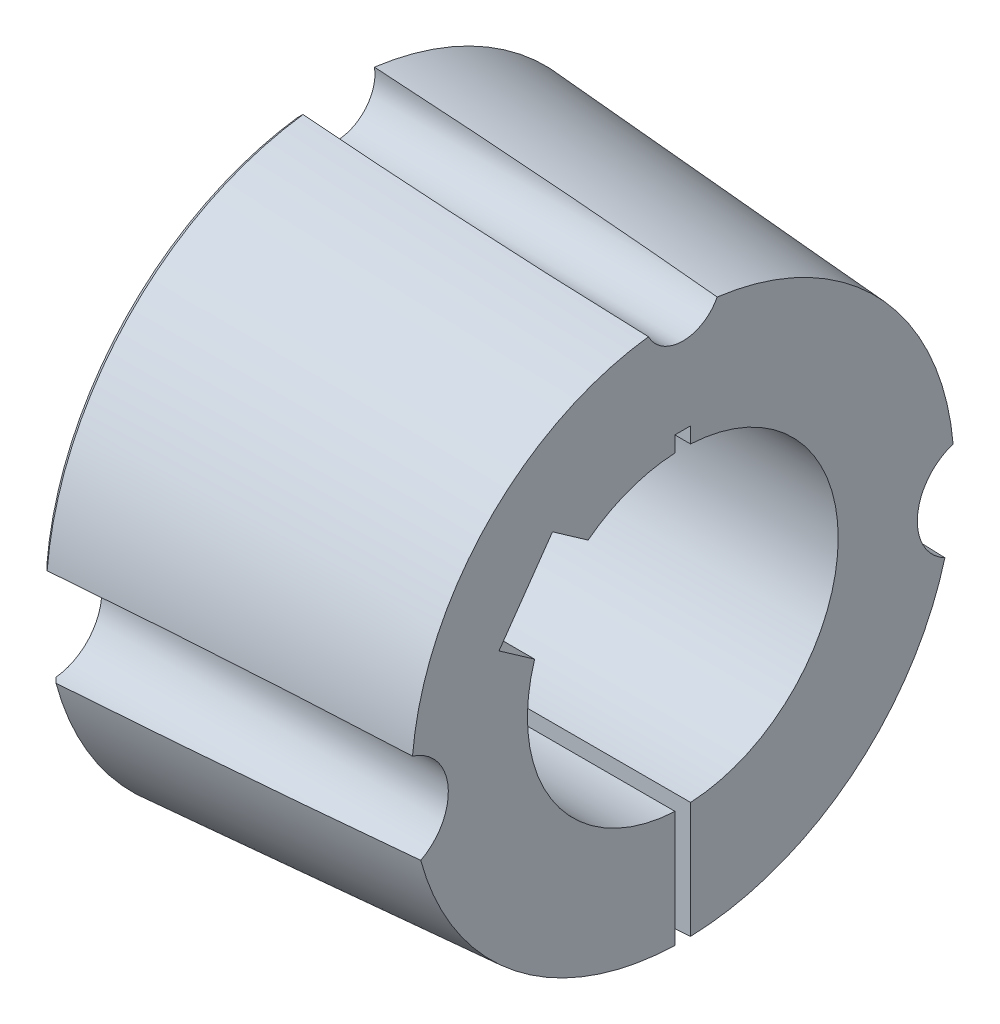
ISO-10303-21;
HEADER;
FILE_DESCRIPTION(('STEP AP214'),'2;1');
FILE_NAME('part.step','',(''),(''),'','','');
FILE_SCHEMA(('AUTOMOTIVE_DESIGN { 1 0 10303 214 1 1 1 1 }'));
ENDSEC;
DATA;
#1=APPLICATION_CONTEXT('core data for automotive mechanical design processes');
#2=APPLICATION_PROTOCOL_DEFINITION('international standard','automotive_design',2000,#1);
#3=PRODUCT_CONTEXT('',#1,'mechanical');
#4=PRODUCT('Part','Part','',(#3));
#5=PRODUCT_RELATED_PRODUCT_CATEGORY('part','',(#4));
#6=PRODUCT_DEFINITION_FORMATION('','',#4);
#7=PRODUCT_DEFINITION_CONTEXT('part definition',#1,'design');
#8=PRODUCT_DEFINITION('design','',#6,#7);
#9=PRODUCT_DEFINITION_SHAPE('','',#8);
#10=(LENGTH_UNIT() NAMED_UNIT(*) SI_UNIT(.MILLI.,.METRE.));
#11=(NAMED_UNIT(*) PLANE_ANGLE_UNIT() SI_UNIT($,.RADIAN.));
#12=(NAMED_UNIT(*) SI_UNIT($,.STERADIAN.) SOLID_ANGLE_UNIT());
#13=UNCERTAINTY_MEASURE_WITH_UNIT(LENGTH_MEASURE(1.E-05),#10,'distance_accuracy_value','');
#14=(GEOMETRIC_REPRESENTATION_CONTEXT(3) GLOBAL_UNCERTAINTY_ASSIGNED_CONTEXT((#13)) GLOBAL_UNIT_ASSIGNED_CONTEXT((#10,
#11,#12)) REPRESENTATION_CONTEXT('',''));
#15=CARTESIAN_POINT('',(0.,0.,0.));
#16=DIRECTION('',(0.,0.,1.));
#17=DIRECTION('',(1.,0.,0.));
#18=AXIS2_PLACEMENT_3D('',#15,#16,#17);
#19=CARTESIAN_POINT('',(0.321710613007411,0.,0.));
#20=DIRECTION('',(-1.,0.,0.));
#21=DIRECTION('',(0.,0.,1.));
#22=AXIS2_PLACEMENT_3D('',#19,#20,#21);
#23=CONICAL_SURFACE('',#22,19.,0.0698131700797628);
#24=CARTESIAN_POINT('',(22.300225,-4.53499188755196,16.8639897053293));
#25=CARTESIAN_POINT('',(21.2029926821861,-4.57130751276671,16.9336722948583));
#26=CARTESIAN_POINT('',(20.1057165569174,-4.60487346054122,17.0040785698467));
#27=CARTESIAN_POINT('',(17.9111518356493,-4.66665786067735,17.1463202732443));
#28=CARTESIAN_POINT('',(16.8138632420395,-4.69487653398318,17.2181556424691));
#29=CARTESIAN_POINT('',(14.4068561282718,-4.75108086887648,17.3772851707053));
#30=CARTESIAN_POINT('',(13.09713165849,-4.77796412131385,17.4648800967851));
#31=CARTESIAN_POINT('',(10.477686174,-4.82438424576258,17.6420807756362));
#32=CARTESIAN_POINT('',(9.16796515930409,-4.84392110290557,17.7316865324768));
#33=CARTESIAN_POINT('',(6.54844282741107,-4.87556126813518,17.9129223402927));
#34=CARTESIAN_POINT('',(5.23864151504193,-4.88766384255145,18.0045525901359));
#35=CARTESIAN_POINT('',(2.61913634890474,-4.90413958469964,18.1898507575066));
#36=CARTESIAN_POINT('',(1.30943249501736,-4.90851276205689,18.2835186724964));
#37=CARTESIAN_POINT('',(-0.00019999999999539,-4.90887484181706,18.3782164925177));
#38=B_SPLINE_CURVE_WITH_KNOTS('',3,(#24,#25,#26,#27,#28,#29,#30,#31,#32,#33,#34,#35,#36,#37),
.UNSPECIFIED.,.F.,.F.,(4,2,2,2,2,2,4),(0.,3.30012145594267,6.6001065243103,10.5388607907242,
14.4776230287312,18.4167739106898,22.3559198872624),.UNSPECIFIED.);
#39=CARTESIAN_POINT('',(22.3,-4.534999338213,16.8640039942232));
#40=VERTEX_POINT('',#39);
#41=CARTESIAN_POINT('',(0.321710613007422,-4.90871157534139,18.3549598384227));
#42=VERTEX_POINT('',#41);
#43=EDGE_CURVE('E224',#40,#42,#38,.T.);
#44=ORIENTED_EDGE('',*,*,#43,.T.);
#45=CARTESIAN_POINT('',(0.321710613007398,0.,0.));
#46=DIRECTION('',(1.,0.,0.));
#47=DIRECTION('',(0.,0.,-1.));
#48=AXIS2_PLACEMENT_3D('',#45,#46,#47);
#49=CIRCLE('',#48,19.);
#50=CARTESIAN_POINT('',(0.321710613007411,-18.9934199132226,0.5));
#51=VERTEX_POINT('',#50);
#52=EDGE_CURVE('E72',#42,#51,#49,.T.);
#53=ORIENTED_EDGE('',*,*,#52,.T.);
#54=CARTESIAN_POINT('',(21.9782893869913,-17.4784742972877,0.5));
#55=CARTESIAN_POINT('',(18.3688601645173,-17.7309734272602,0.5));
#56=CARTESIAN_POINT('',(14.7594306311375,-17.9834681128139,0.5));
#57=CARTESIAN_POINT('',(11.1500008240497,-18.2359588856954,0.5));
#58=CARTESIAN_POINT('',(7.54057101698096,-18.4884496585755,0.5));
#59=CARTESIAN_POINT('',(3.93114093613387,-18.7409365176545,0.5));
#60=CARTESIAN_POINT('',(0.32171061300711,-18.9934199132226,0.5));
#61=B_SPLINE_CURVE_WITH_KNOTS('',3,(#54,#55,#56,#57,#58,#59,#60),.UNSPECIFIED.,.F.,.F.,(4,3,4),
(37.090737703433,47.9454885576051,58.8002394117771),.UNSPECIFIED.);
#62=CARTESIAN_POINT('',(21.978289386993,-17.4784742972877,0.5));
#63=VERTEX_POINT('',#62);
#64=EDGE_CURVE('E796',#63,#51,#61,.T.);
#65=ORIENTED_EDGE('',*,*,#64,.F.);
#66=CARTESIAN_POINT('',(26.2312829592092,-17.1809522478635,0.5));
#67=CARTESIAN_POINT('',(25.5224507218221,-17.2305396084501,0.5));
#68=CARTESIAN_POINT('',(24.8136184721105,-17.2801267928621,0.5));
#69=CARTESIAN_POINT('',(23.3959539480384,-17.3793008093367,0.5));
#70=CARTESIAN_POINT('',(22.6871216736779,-17.4288876413994,0.5));
#71=CARTESIAN_POINT('',(21.978289386993,-17.4784742972875,0.5));
#72=B_SPLINE_CURVE_WITH_KNOTS('',3,(#66,#67,#68,#69,#70,#71),.UNSPECIFIED.,.F.,.F.,(4,2,4),(0.,
2.13169379222291,4.26338758444582),.UNSPECIFIED.);
#73=CARTESIAN_POINT('',(22.3,-17.4559688850195,0.5));
#74=VERTEX_POINT('',#73);
#75=EDGE_CURVE('E257',#63,#74,#72,.F.);
#76=ORIENTED_EDGE('',*,*,#75,.T.);
#77=CARTESIAN_POINT('',(22.3,0.,0.));
#78=DIRECTION('',(-1.,0.,0.));
#79=DIRECTION('',(0.,0.,1.));
#80=AXIS2_PLACEMENT_3D('',#77,#78,#79);
#81=CIRCLE('',#80,17.463128291196);
#82=EDGE_CURVE('E241',#40,#74,#81,.F.);
#83=ORIENTED_EDGE('',*,*,#82,.F.);
#84=EDGE_LOOP('',(#44,#53,#65,#76,#83));
#85=FACE_BOUND('',#84,.T.);
#86=ADVANCED_FACE('F55',(#85),#23,.T.);
#87=CARTESIAN_POINT('',(22.3,1.53769894641273,-17.3952962511413));
#88=VERTEX_POINT('',#87);
#89=CARTESIAN_POINT('',(22.3,17.32239041251,-2.21260934449595));
#90=VERTEX_POINT('',#89);
#91=EDGE_CURVE('E240',#88,#90,#81,.F.);
#92=ORIENTED_EDGE('',*,*,#91,.F.);
#93=CARTESIAN_POINT('',(22.3002249999999,1.53769409018434,-17.3952808855341));
#94=CARTESIAN_POINT('',(21.202992682186,1.56135774476451,-17.4702109820915));
#95=CARTESIAN_POINT('',(20.1057165569173,1.58218782902199,-17.5453762932236));
#96=CARTESIAN_POINT('',(17.9111518356493,1.61833357270802,-17.6961857740231));
#97=CARTESIAN_POINT('',(16.8138632420395,1.6336494600014,-17.7718299237719));
#98=CARTESIAN_POINT('',(14.4068561282718,1.661367372166,-17.9383016972433));
#99=CARTESIAN_POINT('',(13.09713165849,1.67263150830589,-18.0292340873667));
#100=CARTESIAN_POINT('',(10.477686174,1.68757583179495,-18.2118034597559));
#101=CARTESIAN_POINT('',(9.16796515930406,1.69125600379503,-18.3034404434472));
#102=CARTESIAN_POINT('',(6.54844282741105,1.69094421606452,-18.4874171291409));
#103=CARTESIAN_POINT('',(5.23864151504191,1.68695149927663,-18.5797568995894));
#104=CARTESIAN_POINT('',(2.61913634890473,1.67100024879185,-18.7651009540348));
#105=CARTESIAN_POINT('',(1.30943249501735,1.65904172501471,-18.858105237204));
#106=CARTESIAN_POINT('',(-0.000200000000002203,1.64295420009402,-18.9514272590448));
#107=B_SPLINE_CURVE_WITH_KNOTS('',3,(#93,#94,#95,#96,#97,#98,#99,#100,#101,#102,#103,#104,#105,
#106),.UNSPECIFIED.,.F.,.F.,(4,2,2,2,2,2,4),(0.,3.30012145594267,6.6001065243103,
10.5388607907242,14.4776230287312,18.4167739106897,22.3559198872623),.UNSPECIFIED.);
#108=CARTESIAN_POINT('',(0.,1.64295666159162,-18.9514130078315));
#109=VERTEX_POINT('',#108);
#110=EDGE_CURVE('E225',#88,#109,#107,.T.);
#111=ORIENTED_EDGE('',*,*,#110,.T.);
#112=CARTESIAN_POINT('',(0.,0.,0.));
#113=DIRECTION('',(1.,0.,0.));
#114=DIRECTION('',(0.,0.,-1.));
#115=AXIS2_PLACEMENT_3D('',#112,#113,#114);
#116=CIRCLE('',#115,19.022496197536);
#117=CARTESIAN_POINT('',(0.,18.8634118607901,-2.4550060194374));
#118=VERTEX_POINT('',#117);
#119=EDGE_CURVE('E252',#109,#118,#116,.T.);
#120=ORIENTED_EDGE('',*,*,#119,.T.);
#121=CARTESIAN_POINT('',(-0.000200000000000099,18.863426272307,-2.45500365126256));
#122=CARTESIAN_POINT('',(0.826947885151376,18.8038239635185,-2.46478635258426));
#123=CARTESIAN_POINT('',(1.65413976051982,18.7444903423746,-2.47231982342693));
#124=CARTESIAN_POINT('',(3.30854347423624,18.6263654517062,-2.48307237004027));
#125=CARTESIAN_POINT('',(4.13575530881794,18.5675741517388,-2.48629168946545));
#126=CARTESIAN_POINT('',(6.40763126479677,18.4068549672928,-2.48946286339212));
#127=CARTESIAN_POINT('',(7.85234190046941,18.3054811222879,-2.48518275713696));
#128=CARTESIAN_POINT('',(10.7417996378788,18.1043895627516,-2.4644587270166));
#129=CARTESIAN_POINT('',(12.1865467397797,18.0046718579365,-2.44801473181389));
#130=CARTESIAN_POINT('',(14.3537486035918,17.8563336972392,-2.41411441583646));
#131=CARTESIAN_POINT('',(15.0762352343916,17.8070891656695,-2.40127350529982));
#132=CARTESIAN_POINT('',(16.5211738381595,17.7090172339596,-2.37243213064376));
#133=CARTESIAN_POINT('',(17.243625811149,17.6601898335587,-2.35643166849922));
#134=CARTESIAN_POINT('',(18.6884749148327,17.5629534586444,-2.32115959760855));
#135=CARTESIAN_POINT('',(19.410872045767,17.5145444821794,-2.3018880041281));
#136=CARTESIAN_POINT('',(20.8555951097283,17.418145929262,-2.25988613995403));
#137=CARTESIAN_POINT('',(21.5779210426029,17.3701563536879,-2.23715586201814));
#138=CARTESIAN_POINT('',(22.3002,17.3223771823866,-2.21260254219919));
#139=B_SPLINE_CURVE_WITH_KNOTS('',3,(#121,#122,#123,#124,#125,#126,#127,#128,#129,#130,#131,
#132,#133,#134,#135,#136,#137,#138),.UNSPECIFIED.,.F.,.F.,(4,2,2,2,2,2,2,2,4),(0.,
2.48804415378838,4.97594778197863,9.3206995215316,13.6654767419331,15.8383012938678,
18.0111244876726,20.1839375416388,22.356755145399),.UNSPECIFIED.);
#140=EDGE_CURVE('E473',#118,#90,#139,.T.);
#141=ORIENTED_EDGE('',*,*,#140,.T.);
#142=EDGE_LOOP('',(#92,#111,#120,#141));
#143=FACE_BOUND('',#142,.T.);
#144=ADVANCED_FACE('F596',(#143),#23,.T.);
#145=CARTESIAN_POINT('',(22.3002,17.3223771823865,2.21260254219891));
#146=CARTESIAN_POINT('',(21.4731315502401,17.3770882374946,2.24071361094145));
#147=CARTESIAN_POINT('',(20.6460030232875,17.4320750783381,2.26644025400874));
#148=CARTESIAN_POINT('',(18.9917023426933,17.5425953827706,2.31339333712401));
#149=CARTESIAN_POINT('',(18.1645301942971,17.5981288147379,2.33462003592232));
#150=CARTESIAN_POINT('',(15.8927454304661,17.7513951782891,2.38710955603155));
#151=CARTESIAN_POINT('',(14.4480690220482,17.8496896996566,2.41403888197611));
#152=CARTESIAN_POINT('',(11.5586472557555,18.0479420943283,2.45565782221605));
#153=CARTESIAN_POINT('',(10.1139018974634,18.147899979455,2.47034734947711));
#154=CARTESIAN_POINT('',(7.22415880783465,18.3494920202942,2.48753377254478));
#155=CARTESIAN_POINT('',(5.77916108448604,18.4511265106142,2.49002820424783));
#156=CARTESIAN_POINT('',(3.61178688625728,18.6048138972709,2.48423978385791));
#157=CARTESIAN_POINT('',(2.88935148918672,18.656248804361,2.48072199177891));
#158=CARTESIAN_POINT('',(1.44453288664433,18.7595295936493,2.47037753456222));
#159=CARTESIAN_POINT('',(0.722149681244098,18.8113754764009,2.4635508649685));
#160=CARTESIAN_POINT('',(-0.000199999999999866,18.863426272307,2.45500365126257));
#161=B_SPLINE_CURVE_WITH_KNOTS('',3,(#145,#146,#147,#148,#149,#150,#151,#152,#153,#154,#155,
#156,#157,#158,#159,#160),.UNSPECIFIED.,.F.,.F.,(4,2,2,2,2,2,2,4),(0.,2.48804980679473,
4.97595650994824,9.32069752319305,13.6654694306017,18.0111191930098,20.1839304112457,
22.3567445555784),.UNSPECIFIED.);
#162=CARTESIAN_POINT('',(22.3,17.32239041251,2.21260934449595));
#163=VERTEX_POINT('',#162);
#164=CARTESIAN_POINT('',(0.321710613007411,18.8402438871912,2.45870093162105));
#165=VERTEX_POINT('',#164);
#166=EDGE_CURVE('E482',#163,#165,#161,.T.);
#167=ORIENTED_EDGE('',*,*,#166,.T.);
#168=CARTESIAN_POINT('',(0.321710613007398,0.,0.));
#169=DIRECTION('',(1.,0.,0.));
#170=DIRECTION('',(0.,0.,-1.));
#171=AXIS2_PLACEMENT_3D('',#168,#169,#170);
#172=CIRCLE('',#171,19.);
#173=CARTESIAN_POINT('',(0.321710613007408,1.64683188960518,18.928495574857));
#174=VERTEX_POINT('',#173);
#175=EDGE_CURVE('E221',#165,#174,#172,.T.);
#176=ORIENTED_EDGE('',*,*,#175,.T.);
#177=CARTESIAN_POINT('',(-0.000200000000001238,1.64295420009402,18.9514272590448));
#178=CARTESIAN_POINT('',(1.09697884318652,1.65644274797768,18.8732452548758));
#179=CARTESIAN_POINT('',(2.19420780325158,1.66702030103823,18.7952851082029));
#180=CARTESIAN_POINT('',(4.38869275780707,1.68254672135523,18.6398308375964));
#181=CARTESIAN_POINT('',(5.48594874926451,1.6874958232003,18.5623366943741));
#182=CARTESIAN_POINT('',(7.89290156631143,1.69239176741303,18.392876639078));
#183=CARTESIAN_POINT('',(9.20260800945734,1.69118491240795,18.3010130150501));
#184=CARTESIAN_POINT('',(11.8220435960219,1.68117182285268,18.1179876587348));
#185=CARTESIAN_POINT('',(13.1317727394874,1.67236557007188,18.0268259281318));
#186=CARTESIAN_POINT('',(15.7513379372384,1.64715838942917,17.8451990431438));
#187=CARTESIAN_POINT('',(17.0611739891641,1.6307567044744,17.7547339591129));
#188=CARTESIAN_POINT('',(19.6807690472532,1.59013999727152,17.5744938834072));
#189=CARTESIAN_POINT('',(20.9905280535943,1.56592499381336,17.4847188900735));
#190=CARTESIAN_POINT('',(22.3002249999999,1.53769409018434,17.3952808855341));
#191=B_SPLINE_CURVE_WITH_KNOTS('',3,(#177,#178,#179,#180,#181,#182,#183,#184,#185,#186,#187,
#188,#189,#190),.UNSPECIFIED.,.F.,.F.,(4,2,2,2,2,2,4),(0.,3.30012436560101,6.60011118003683,
10.5388623238024,14.4776229164753,18.41677619906,22.3559200085984),.UNSPECIFIED.);
#192=CARTESIAN_POINT('',(22.3,1.53769894641273,17.3952962511413));
#193=VERTEX_POINT('',#192);
#194=EDGE_CURVE('E214',#174,#193,#191,.T.);
#195=ORIENTED_EDGE('',*,*,#194,.T.);
#196=EDGE_CURVE('E219',#163,#193,#81,.F.);
#197=ORIENTED_EDGE('',*,*,#196,.F.);
#198=EDGE_LOOP('',(#167,#176,#195,#197));
#199=FACE_BOUND('',#198,.T.);
#200=ADVANCED_FACE('F217',(#199),#23,.T.);
#201=CARTESIAN_POINT('',(0.,0.,0.));
#202=DIRECTION('',(1.,0.,0.));
#203=DIRECTION('',(0.,0.,-1.));
#204=AXIS2_PLACEMENT_3D('',#201,#202,#203);
#205=CYLINDRICAL_SURFACE('',#204,10.);
#206=CARTESIAN_POINT('',(0.,0.,0.));
#207=DIRECTION('',(1.,0.,0.));
#208=DIRECTION('',(0.,0.,-1.));
#209=AXIS2_PLACEMENT_3D('',#206,#207,#208);
#210=CIRCLE('',#209,10.);
#211=CARTESIAN_POINT('',(0.,9.98749217771904,0.5));
#212=VERTEX_POINT('',#211);
#213=CARTESIAN_POINT('',(-6.25000000191445E-06,7.92902660930991,6.09348316062781));
#214=VERTEX_POINT('',#213);
#215=EDGE_CURVE('E655',#212,#214,#210,.T.);
#216=ORIENTED_EDGE('',*,*,#215,.F.);
#217=DIRECTION('',(1.,0.,0.));
#218=VECTOR('',#217,1.);
#219=CARTESIAN_POINT('',(0.,9.98749217771904,0.5));
#220=LINE('',#219,#218);
#221=CARTESIAN_POINT('',(22.3,9.98749217771904,0.5));
#222=VERTEX_POINT('',#221);
#223=EDGE_CURVE('E642',#212,#222,#220,.T.);
#224=ORIENTED_EDGE('',*,*,#223,.T.);
#225=CARTESIAN_POINT('',(22.3,0.,0.));
#226=DIRECTION('',(1.,0.,0.));
#227=DIRECTION('',(0.,0.,-1.));
#228=AXIS2_PLACEMENT_3D('',#225,#226,#227);
#229=CIRCLE('',#228,10.);
#230=CARTESIAN_POINT('',(22.3,7.92902660930991,6.09348316062782));
#231=VERTEX_POINT('',#230);
#232=EDGE_CURVE('E790',#222,#231,#229,.T.);
#233=ORIENTED_EDGE('',*,*,#232,.T.);
#234=DIRECTION('',(1.,0.,0.));
#235=VECTOR('',#234,1.);
#236=CARTESIAN_POINT('',(0.,7.92902660930991,6.09348316062781));
#237=LINE('',#236,#235);
#238=EDGE_CURVE('E676',#231,#214,#237,.F.);
#239=ORIENTED_EDGE('',*,*,#238,.T.);
#240=EDGE_LOOP('',(#216,#224,#233,#239));
#241=FACE_BOUND('',#240,.T.);
#242=ADVANCED_FACE('F584',(#241),#205,.F.);
#243=CARTESIAN_POINT('',(-6.25000000191445E-06,3.01411434357601,9.53494177873411));
#244=VERTEX_POINT('',#243);
#245=CARTESIAN_POINT('',(0.,-9.98749217771914,0.5));
#246=VERTEX_POINT('',#245);
#247=EDGE_CURVE('E659',#244,#246,#210,.T.);
#248=ORIENTED_EDGE('',*,*,#247,.F.);
#249=DIRECTION('',(1.,0.,0.));
#250=VECTOR('',#249,1.);
#251=CARTESIAN_POINT('',(0.,3.01411434357601,9.53494177873411));
#252=LINE('',#251,#250);
#253=CARTESIAN_POINT('',(22.3,3.01411434357601,9.53494177873411));
#254=VERTEX_POINT('',#253);
#255=EDGE_CURVE('E652',#244,#254,#252,.T.);
#256=ORIENTED_EDGE('',*,*,#255,.T.);
#257=CARTESIAN_POINT('',(22.3,-9.98749217771914,0.5));
#258=VERTEX_POINT('',#257);
#259=EDGE_CURVE('E703',#254,#258,#229,.T.);
#260=ORIENTED_EDGE('',*,*,#259,.T.);
#261=DIRECTION('',(1.,0.,0.));
#262=VECTOR('',#261,1.);
#263=CARTESIAN_POINT('',(22.3,-9.98749217771914,0.5));
#264=LINE('',#263,#262);
#265=EDGE_CURVE('E266',#258,#246,#264,.F.);
#266=ORIENTED_EDGE('',*,*,#265,.T.);
#267=EDGE_LOOP('',(#248,#256,#260,#266));
#268=FACE_BOUND('',#267,.T.);
#269=ADVANCED_FACE('F585',(#268),#205,.F.);
#270=CARTESIAN_POINT('',(22.3,-19.,-0.5));
#271=DIRECTION('',(0.,0.,1.));
#272=DIRECTION('',(1.,0.,0.));
#273=AXIS2_PLACEMENT_3D('',#270,#271,#272);
#274=PLANE('',#273);
#275=DIRECTION('',(0.,1.,0.));
#276=VECTOR('',#275,1.);
#277=CARTESIAN_POINT('',(0.,-18.6933143128767,-0.5));
#278=LINE('',#277,#276);
#279=CARTESIAN_POINT('',(0.,-18.6933143128767,-0.5));
#280=VERTEX_POINT('',#279);
#281=CARTESIAN_POINT('',(0.,-9.98749217771914,-0.5));
#282=VERTEX_POINT('',#281);
#283=EDGE_CURVE('E773',#280,#282,#278,.T.);
#284=ORIENTED_EDGE('',*,*,#283,.F.);
#285=CARTESIAN_POINT('',(0.,-18.6933143128767,-0.5));
#286=CARTESIAN_POINT('',(0.053618295711693,-18.7433320627875,-0.5));
#287=CARTESIAN_POINT('',(0.107236661318159,-18.7933497377718,-0.5));
#288=CARTESIAN_POINT('',(0.214473532320634,-18.8933849378871,-0.5));
#289=CARTESIAN_POINT('',(0.268092037716643,-18.9434024630181,-0.5));
#290=CARTESIAN_POINT('',(0.321710613007425,-18.9934199132226,-0.5));
#291=B_SPLINE_CURVE_WITH_KNOTS('',3,(#285,#286,#287,#288,#289,#290),.UNSPECIFIED.,.F.,.F.,(4,2,
4),(0.,0.219977890866889,0.439955781733767),.UNSPECIFIED.);
#292=CARTESIAN_POINT('',(0.321710613007411,-18.9934199132226,-0.5));
#293=VERTEX_POINT('',#292);
#294=EDGE_CURVE('E609',#280,#293,#291,.T.);
#295=ORIENTED_EDGE('',*,*,#294,.T.);
#296=CARTESIAN_POINT('',(0.321710613007335,-18.9934199132226,-0.5));
#297=CARTESIAN_POINT('',(1.40858716992892,-18.9173917705274,-0.5));
#298=CARTESIAN_POINT('',(2.49546370484753,-18.8413633132852,-0.5));
#299=CARTESIAN_POINT('',(3.58234021695097,-18.7653345298854,-0.5));
#300=CARTESIAN_POINT('',(9.71432405345054,-18.3363922666888,-0.5));
#301=CARTESIAN_POINT('',(15.8463071675463,-17.9074396765716,-0.5));
#302=CARTESIAN_POINT('',(21.9782893869957,-17.4784742972874,-0.5));
#303=B_SPLINE_CURVE_WITH_KNOTS('',3,(#296,#297,#298,#299,#300,#301,#302),.UNSPECIFIED.,.F.,.F.,
(4,3,4),(37.0907060555158,40.3593033626361,58.8002077636762),.UNSPECIFIED.);
#304=CARTESIAN_POINT('',(21.978289386993,-17.4784742972877,-0.5));
#305=VERTEX_POINT('',#304);
#306=EDGE_CURVE('E635',#293,#305,#303,.T.);
#307=ORIENTED_EDGE('',*,*,#306,.T.);
#308=CARTESIAN_POINT('',(26.2312829592092,-17.1809522478635,-0.5));
#309=CARTESIAN_POINT('',(25.5224507218221,-17.2305396084501,-0.5));
#310=CARTESIAN_POINT('',(24.8136184721105,-17.2801267928621,-0.5));
#311=CARTESIAN_POINT('',(23.3959539480384,-17.3793008093367,-0.5));
#312=CARTESIAN_POINT('',(22.6871216736779,-17.4288876413994,-0.5));
#313=CARTESIAN_POINT('',(21.978289386993,-17.4784742972875,-0.5));
#314=B_SPLINE_CURVE_WITH_KNOTS('',3,(#308,#309,#310,#311,#312,#313),.UNSPECIFIED.,.F.,.F.,(4,2,
4),(0.,2.13169379222291,4.26338758444582),.UNSPECIFIED.);
#315=CARTESIAN_POINT('',(22.3,-17.4559688850195,-0.5));
#316=VERTEX_POINT('',#315);
#317=EDGE_CURVE('E247',#305,#316,#314,.F.);
#318=ORIENTED_EDGE('',*,*,#317,.T.);
#319=DIRECTION('',(0.,1.,0.));
#320=VECTOR('',#319,1.);
#321=CARTESIAN_POINT('',(22.3,-17.1333379284425,-0.5));
#322=LINE('',#321,#320);
#323=CARTESIAN_POINT('',(22.3,-9.98749217771914,-0.5));
#324=VERTEX_POINT('',#323);
#325=EDGE_CURVE('E775',#316,#324,#322,.T.);
#326=ORIENTED_EDGE('',*,*,#325,.T.);
#327=DIRECTION('',(1.,0.,0.));
#328=VECTOR('',#327,1.);
#329=CARTESIAN_POINT('',(22.3,-9.98749217771914,-0.5));
#330=LINE('',#329,#328);
#331=EDGE_CURVE('E334',#282,#324,#330,.T.);
#332=ORIENTED_EDGE('',*,*,#331,.F.);
#333=EDGE_LOOP('',(#284,#295,#307,#318,#326,#332));
#334=FACE_BOUND('',#333,.T.);
#335=ADVANCED_FACE('F411',(#334),#274,.T.);
#336=CARTESIAN_POINT('',(0.,0.,0.));
#337=DIRECTION('',(1.,0.,0.));
#338=DIRECTION('',(0.,0.,-1.));
#339=AXIS2_PLACEMENT_3D('',#336,#337,#338);
#340=PLANE('',#339);
#341=CARTESIAN_POINT('',(0.,-1.60889501112176,18.3897541267737));
#342=DIRECTION('',(-1.,0.,0.));
#343=DIRECTION('',(0.,0.,1.));
#344=AXIS2_PLACEMENT_3D('',#341,#342,#343);
#345=CIRCLE('',#344,3.29999999999999);
#346=CARTESIAN_POINT('',(0.,1.68277130914276,18.6241316769702));
#347=VERTEX_POINT('',#346);
#348=CARTESIAN_POINT('',(0.,-4.8912527581251,18.0489790973377));
#349=VERTEX_POINT('',#348);
#350=EDGE_CURVE('E760',#347,#349,#345,.T.);
#351=ORIENTED_EDGE('',*,*,#350,.F.);
#352=CARTESIAN_POINT('',(0.,0.,0.));
#353=DIRECTION('',(1.,0.,0.));
#354=DIRECTION('',(0.,0.,-1.));
#355=AXIS2_PLACEMENT_3D('',#352,#353,#354);
#356=CIRCLE('',#355,18.7);
#357=CARTESIAN_POINT('',(0.,18.5339058590222,2.48683204276087));
#358=VERTEX_POINT('',#357);
#359=EDGE_CURVE('E544',#347,#358,#356,.F.);
#360=ORIENTED_EDGE('',*,*,#359,.T.);
#361=CARTESIAN_POINT('',(0.,18.46,0.));
#362=DIRECTION('',(-1.,0.,0.));
#363=DIRECTION('',(0.,0.,1.));
#364=AXIS2_PLACEMENT_3D('',#361,#362,#363);
#365=CIRCLE('',#364,2.48793);
#366=EDGE_CURVE('E751',#118,#358,#365,.T.);
#367=ORIENTED_EDGE('',*,*,#366,.F.);
#368=ORIENTED_EDGE('',*,*,#119,.F.);
#369=CARTESIAN_POINT('',(0.,-1.60889501112176,-18.3897541267737));
#370=DIRECTION('',(-1.,0.,0.));
#371=DIRECTION('',(0.,0.,1.));
#372=AXIS2_PLACEMENT_3D('',#369,#370,#371);
#373=CIRCLE('',#372,3.29999999999999);
#374=CARTESIAN_POINT('',(0.,-4.8912527581251,-18.0489790973377));
#375=VERTEX_POINT('',#374);
#376=EDGE_CURVE('E757',#375,#109,#373,.T.);
#377=ORIENTED_EDGE('',*,*,#376,.F.);
#378=CARTESIAN_POINT('',(0.,0.,0.));
#379=DIRECTION('',(1.,0.,0.));
#380=DIRECTION('',(0.,0.,-1.));
#381=AXIS2_PLACEMENT_3D('',#378,#379,#380);
#382=CIRCLE('',#381,18.7);
#383=EDGE_CURVE('E768',#375,#280,#382,.F.);
#384=ORIENTED_EDGE('',*,*,#383,.T.);
#385=ORIENTED_EDGE('',*,*,#283,.T.);
#386=CARTESIAN_POINT('',(0.,9.98749217771904,-0.5));
#387=VERTEX_POINT('',#386);
#388=EDGE_CURVE('E658',#282,#387,#210,.T.);
#389=ORIENTED_EDGE('',*,*,#388,.T.);
#390=DIRECTION('',(0.,1.,0.));
#391=VECTOR('',#390,1.);
#392=CARTESIAN_POINT('',(0.,0.,-0.5));
#393=LINE('',#392,#391);
#394=CARTESIAN_POINT('',(0.,11.,-0.5));
#395=VERTEX_POINT('',#394);
#396=EDGE_CURVE('E728',#387,#395,#393,.T.);
#397=ORIENTED_EDGE('',*,*,#396,.T.);
#398=DIRECTION('',(0.,0.,1.));
#399=VECTOR('',#398,1.);
#400=CARTESIAN_POINT('',(0.,11.,0.));
#401=LINE('',#400,#399);
#402=CARTESIAN_POINT('',(0.,11.,0.5));
#403=VERTEX_POINT('',#402);
#404=EDGE_CURVE('E720',#395,#403,#401,.T.);
#405=ORIENTED_EDGE('',*,*,#404,.T.);
#406=DIRECTION('',(0.,-1.,0.));
#407=VECTOR('',#406,1.);
#408=CARTESIAN_POINT('',(0.,0.,0.5));
#409=LINE('',#408,#407);
#410=EDGE_CURVE('E724',#403,#212,#409,.T.);
#411=ORIENTED_EDGE('',*,*,#410,.T.);
#412=ORIENTED_EDGE('',*,*,#215,.T.);
#413=DIRECTION('',(0.,0.573576436351084,0.819152044288965));
#414=VECTOR('',#413,1.);
#415=CARTESIAN_POINT('',(0.,2.45745613286654,-1.72072930905301));
#416=LINE('',#415,#414);
#417=CARTESIAN_POINT('',(0.,9.53504063109267,8.38710888463652));
#418=VERTEX_POINT('',#417);
#419=EDGE_CURVE('E695',#214,#418,#416,.T.);
#420=ORIENTED_EDGE('',*,*,#419,.T.);
#421=DIRECTION('',(0.,-0.819152044288965,0.573576436351084));
#422=VECTOR('',#421,1.);
#423=CARTESIAN_POINT('',(0.,7.07758449822612,10.1078381936895));
#424=LINE('',#423,#422);
#425=CARTESIAN_POINT('',(0.,4.6201283653589,11.828567502743));
#426=VERTEX_POINT('',#425);
#427=EDGE_CURVE('E694',#418,#426,#424,.T.);
#428=ORIENTED_EDGE('',*,*,#427,.T.);
#429=DIRECTION('',(0.,-0.573576436351085,-0.819152044288965));
#430=VECTOR('',#429,1.);
#431=CARTESIAN_POINT('',(0.,-2.45745613286723,1.72072930905349));
#432=LINE('',#431,#430);
#433=EDGE_CURVE('E690',#426,#244,#432,.T.);
#434=ORIENTED_EDGE('',*,*,#433,.T.);
#435=ORIENTED_EDGE('',*,*,#247,.T.);
#436=DIRECTION('',(0.,-1.,0.));
#437=VECTOR('',#436,1.);
#438=CARTESIAN_POINT('',(0.,-9.98749217771913,0.5));
#439=LINE('',#438,#437);
#440=CARTESIAN_POINT('',(0.,-18.6933143128767,0.5));
#441=VERTEX_POINT('',#440);
#442=EDGE_CURVE('E340',#246,#441,#439,.T.);
#443=ORIENTED_EDGE('',*,*,#442,.T.);
#444=CARTESIAN_POINT('',(0.,0.,0.));
#445=DIRECTION('',(1.,0.,0.));
#446=DIRECTION('',(0.,0.,-1.));
#447=AXIS2_PLACEMENT_3D('',#444,#445,#446);
#448=CIRCLE('',#447,18.7);
#449=EDGE_CURVE('E765',#441,#349,#448,.F.);
#450=ORIENTED_EDGE('',*,*,#449,.T.);
#451=EDGE_LOOP('',(#351,#360,#367,#368,#377,#384,#385,#389,#397,#405,#411,#412,#420,#428,#434,
#435,#443,#450));
#452=FACE_BOUND('',#451,.T.);
#453=ADVANCED_FACE('F586',(#452),#340,.F.);
#454=CARTESIAN_POINT('',(22.3,23.473965426993,0.));
#455=DIRECTION('',(-1.,0.,0.));
#456=DIRECTION('',(0.,0.,1.));
#457=AXIS2_PLACEMENT_3D('',#454,#455,#456);
#458=PLANE('',#457);
#459=ORIENTED_EDGE('',*,*,#196,.T.);
#460=CARTESIAN_POINT('',(22.3,-1.60889501112176,18.3897541267737));
#461=DIRECTION('',(-1.,0.,0.));
#462=DIRECTION('',(0.,0.,1.));
#463=AXIS2_PLACEMENT_3D('',#460,#461,#462);
#464=CIRCLE('',#463,3.29999999999999);
#465=EDGE_CURVE('E228',#193,#40,#464,.T.);
#466=ORIENTED_EDGE('',*,*,#465,.T.);
#467=ORIENTED_EDGE('',*,*,#82,.T.);
#468=DIRECTION('',(0.,-1.,0.));
#469=VECTOR('',#468,1.);
#470=CARTESIAN_POINT('',(22.3,-9.98749217771913,0.5));
#471=LINE('',#470,#469);
#472=EDGE_CURVE('E299',#258,#74,#471,.T.);
#473=ORIENTED_EDGE('',*,*,#472,.F.);
#474=ORIENTED_EDGE('',*,*,#259,.F.);
#475=DIRECTION('',(0.,-0.573576436351085,-0.819152044288965));
#476=VECTOR('',#475,1.);
#477=CARTESIAN_POINT('',(22.3,4.6201283653589,11.828567502743));
#478=LINE('',#477,#476);
#479=CARTESIAN_POINT('',(22.3,4.6201283653589,11.828567502743));
#480=VERTEX_POINT('',#479);
#481=EDGE_CURVE('E707',#480,#254,#478,.T.);
#482=ORIENTED_EDGE('',*,*,#481,.F.);
#483=DIRECTION('',(0.,-0.819152044288965,0.573576436351084));
#484=VECTOR('',#483,1.);
#485=CARTESIAN_POINT('',(22.3,9.53504063109267,8.38710888463652));
#486=LINE('',#485,#484);
#487=CARTESIAN_POINT('',(22.3,9.53504063109267,8.38710888463652));
#488=VERTEX_POINT('',#487);
#489=EDGE_CURVE('E712',#488,#480,#486,.T.);
#490=ORIENTED_EDGE('',*,*,#489,.F.);
#491=DIRECTION('',(0.,0.573576436351084,0.819152044288965));
#492=VECTOR('',#491,1.);
#493=CARTESIAN_POINT('',(22.3,7.92902660930991,6.09348316062782));
#494=LINE('',#493,#492);
#495=EDGE_CURVE('E716',#231,#488,#494,.T.);
#496=ORIENTED_EDGE('',*,*,#495,.F.);
#497=ORIENTED_EDGE('',*,*,#232,.F.);
#498=DIRECTION('',(0.,-1.,0.));
#499=VECTOR('',#498,1.);
#500=CARTESIAN_POINT('',(22.3,11.,0.5));
#501=LINE('',#500,#499);
#502=CARTESIAN_POINT('',(22.3,11.,0.5));
#503=VERTEX_POINT('',#502);
#504=EDGE_CURVE('E736',#503,#222,#501,.T.);
#505=ORIENTED_EDGE('',*,*,#504,.F.);
#506=DIRECTION('',(0.,0.,1.));
#507=VECTOR('',#506,1.);
#508=CARTESIAN_POINT('',(22.3,11.,-0.5));
#509=LINE('',#508,#507);
#510=CARTESIAN_POINT('',(22.3,11.,-0.5));
#511=VERTEX_POINT('',#510);
#512=EDGE_CURVE('E741',#511,#503,#509,.T.);
#513=ORIENTED_EDGE('',*,*,#512,.F.);
#514=DIRECTION('',(0.,1.,0.));
#515=VECTOR('',#514,1.);
#516=CARTESIAN_POINT('',(22.3,9.98749217771904,-0.5));
#517=LINE('',#516,#515);
#518=CARTESIAN_POINT('',(22.3,9.98749217771904,-0.5));
#519=VERTEX_POINT('',#518);
#520=EDGE_CURVE('E745',#519,#511,#517,.T.);
#521=ORIENTED_EDGE('',*,*,#520,.F.);
#522=EDGE_CURVE('E663',#324,#519,#229,.T.);
#523=ORIENTED_EDGE('',*,*,#522,.F.);
#524=ORIENTED_EDGE('',*,*,#325,.F.);
#525=CARTESIAN_POINT('',(22.3,-4.534999338213,-16.8640039942232));
#526=VERTEX_POINT('',#525);
#527=EDGE_CURVE('E243',#316,#526,#81,.F.);
#528=ORIENTED_EDGE('',*,*,#527,.T.);
#529=CARTESIAN_POINT('',(22.3,-1.60889501112176,-18.3897541267737));
#530=DIRECTION('',(-1.,0.,0.));
#531=DIRECTION('',(0.,0.,1.));
#532=AXIS2_PLACEMENT_3D('',#529,#530,#531);
#533=CIRCLE('',#532,3.29999999999999);
#534=EDGE_CURVE('E637',#526,#88,#533,.T.);
#535=ORIENTED_EDGE('',*,*,#534,.T.);
#536=ORIENTED_EDGE('',*,*,#91,.T.);
#537=CARTESIAN_POINT('',(22.3,18.46,0.));
#538=DIRECTION('',(-1.,0.,0.));
#539=DIRECTION('',(0.,0.,1.));
#540=AXIS2_PLACEMENT_3D('',#537,#538,#539);
#541=CIRCLE('',#540,2.48793);
#542=EDGE_CURVE('E238',#90,#163,#541,.T.);
#543=ORIENTED_EDGE('',*,*,#542,.T.);
#544=EDGE_LOOP('',(#459,#466,#467,#473,#474,#482,#490,#496,#497,#505,#513,#521,#523,#524,#528,
#535,#536,#543));
#545=FACE_BOUND('',#544,.T.);
#546=ADVANCED_FACE('F236',(#545),#458,.F.);
#547=ORIENTED_EDGE('',*,*,#306,.F.);
#548=CARTESIAN_POINT('',(0.321710613007398,0.,0.));
#549=DIRECTION('',(1.,0.,0.));
#550=DIRECTION('',(0.,0.,-1.));
#551=AXIS2_PLACEMENT_3D('',#548,#549,#550);
#552=CIRCLE('',#551,19.);
#553=CARTESIAN_POINT('',(0.32171061300742,-4.90871157534137,-18.3549598384227));
#554=VERTEX_POINT('',#553);
#555=EDGE_CURVE('E543',#293,#554,#552,.T.);
#556=ORIENTED_EDGE('',*,*,#555,.T.);
#557=CARTESIAN_POINT('',(-0.000199999999997219,-4.90887484181706,-18.3782164925177));
#558=CARTESIAN_POINT('',(1.09697884318652,-4.90858230579946,-18.2988799869066));
#559=CARTESIAN_POINT('',(2.19420780325158,-4.905461524661,-18.2202674572241));
#560=CARTESIAN_POINT('',(4.38869275780708,-4.89375771296435,-18.0644787516982));
#561=CARTESIAN_POINT('',(5.48594874926452,-4.88517491008141,-17.9873025161233));
#562=CARTESIAN_POINT('',(7.89290156631144,-4.86057004411091,-17.8195667680514));
#563=CARTESIAN_POINT('',(9.20260800945736,-4.84342957303882,-17.7293083270612));
#564=CARTESIAN_POINT('',(11.8220435960219,-4.80178658522219,-17.5508022919182));
#565=CARTESIAN_POINT('',(13.1317727394875,-4.7772840508165,-17.4625547025898));
#566=CARTESIAN_POINT('',(15.7513379372384,-4.72092064629449,-17.2880643190809));
#567=CARTESIAN_POINT('',(17.0611739891641,-4.68905904280411,-17.2018217256534));
#568=CARTESIAN_POINT('',(19.6807690472533,-4.61776103396006,-17.0313729188836));
#569=CARTESIAN_POINT('',(20.9905280535944,-4.57832464682278,-16.9471667006446));
#570=CARTESIAN_POINT('',(22.300225,-4.53499188755196,-16.8639897053293));
#571=B_SPLINE_CURVE_WITH_KNOTS('',3,(#557,#558,#559,#560,#561,#562,#563,#564,#565,#566,#567,
#568,#569,#570),.UNSPECIFIED.,.F.,.F.,(4,2,2,2,2,2,4),(0.,3.30012436560101,6.60011118003683,
10.5388623238024,14.4776229164753,18.4167761990601,22.3559200085984),.UNSPECIFIED.);
#572=EDGE_CURVE('E489',#554,#526,#571,.T.);
#573=ORIENTED_EDGE('',*,*,#572,.T.);
#574=ORIENTED_EDGE('',*,*,#527,.F.);
#575=ORIENTED_EDGE('',*,*,#317,.F.);
#576=EDGE_LOOP('',(#547,#556,#573,#574,#575));
#577=FACE_BOUND('',#576,.T.);
#578=ADVANCED_FACE('F399',(#577),#23,.T.);
#579=CARTESIAN_POINT('',(22.3,11.,0.5));
#580=DIRECTION('',(0.,0.,-1.));
#581=DIRECTION('',(-1.,0.,0.));
#582=AXIS2_PLACEMENT_3D('',#579,#580,#581);
#583=PLANE('',#582);
#584=ORIENTED_EDGE('',*,*,#64,.T.);
#585=CARTESIAN_POINT('',(0.321710613007419,-18.9934199132226,0.5));
#586=CARTESIAN_POINT('',(0.268092037716638,-18.9434024630181,0.5));
#587=CARTESIAN_POINT('',(0.214473532320629,-18.8933849378871,0.5));
#588=CARTESIAN_POINT('',(0.107236661318156,-18.7933497377718,0.5));
#589=CARTESIAN_POINT('',(0.0536182957116918,-18.7433320627875,0.5));
#590=CARTESIAN_POINT('',(0.,-18.6933143128767,0.5));
#591=B_SPLINE_CURVE_WITH_KNOTS('',3,(#585,#586,#587,#588,#589,#590),.UNSPECIFIED.,.F.,.F.,(4,2,
4),(0.,0.219977890866877,0.439955781733761),.UNSPECIFIED.);
#592=EDGE_CURVE('E13',#51,#441,#591,.T.);
#593=ORIENTED_EDGE('',*,*,#592,.T.);
#594=ORIENTED_EDGE('',*,*,#442,.F.);
#595=ORIENTED_EDGE('',*,*,#265,.F.);
#596=ORIENTED_EDGE('',*,*,#472,.T.);
#597=ORIENTED_EDGE('',*,*,#75,.F.);
#598=EDGE_LOOP('',(#584,#593,#594,#595,#596,#597));
#599=FACE_BOUND('',#598,.T.);
#600=ADVANCED_FACE('F408',(#599),#583,.T.);
#601=ORIENTED_EDGE('',*,*,#522,.T.);
#602=DIRECTION('',(1.,0.,0.));
#603=VECTOR('',#602,1.);
#604=CARTESIAN_POINT('',(0.,9.98749217771904,-0.5));
#605=LINE('',#604,#603);
#606=EDGE_CURVE('E646',#519,#387,#605,.F.);
#607=ORIENTED_EDGE('',*,*,#606,.T.);
#608=ORIENTED_EDGE('',*,*,#388,.F.);
#609=ORIENTED_EDGE('',*,*,#331,.T.);
#610=EDGE_LOOP('',(#601,#607,#608,#609));
#611=FACE_BOUND('',#610,.T.);
#612=ADVANCED_FACE('F577',(#611),#205,.F.);
#613=CARTESIAN_POINT('',(-2.50000000076578E-05,9.53504063109267,8.38710888463652));
#614=DIRECTION('',(0.,0.573576436351084,0.819152044288965));
#615=DIRECTION('',(0.,-0.819152044288965,0.573576436351084));
#616=AXIS2_PLACEMENT_3D('',#613,#614,#615);
#617=PLANE('',#616);
#618=DIRECTION('',(1.,0.,0.));
#619=VECTOR('',#618,1.);
#620=CARTESIAN_POINT('',(-2.50000000076578E-05,9.53504063109267,8.38710888463652));
#621=LINE('',#620,#619);
#622=EDGE_CURVE('E704',#418,#488,#621,.T.);
#623=ORIENTED_EDGE('',*,*,#622,.T.);
#624=ORIENTED_EDGE('',*,*,#489,.T.);
#625=DIRECTION('',(1.,0.,0.));
#626=VECTOR('',#625,1.);
#627=CARTESIAN_POINT('',(-2.50000000076578E-05,4.6201283653589,11.828567502743));
#628=LINE('',#627,#626);
#629=EDGE_CURVE('E699',#426,#480,#628,.T.);
#630=ORIENTED_EDGE('',*,*,#629,.F.);
#631=ORIENTED_EDGE('',*,*,#427,.F.);
#632=EDGE_LOOP('',(#623,#624,#630,#631));
#633=FACE_BOUND('',#632,.T.);
#634=ADVANCED_FACE('F573',(#633),#617,.F.);
#635=CARTESIAN_POINT('',(-2.50000000076578E-05,4.6201283653589,11.828567502743));
#636=DIRECTION('',(0.,-0.819152044288965,0.573576436351085));
#637=DIRECTION('',(0.,-0.573576436351085,-0.819152044288965));
#638=AXIS2_PLACEMENT_3D('',#635,#636,#637);
#639=PLANE('',#638);
#640=ORIENTED_EDGE('',*,*,#629,.T.);
#641=ORIENTED_EDGE('',*,*,#481,.T.);
#642=ORIENTED_EDGE('',*,*,#255,.F.);
#643=ORIENTED_EDGE('',*,*,#433,.F.);
#644=EDGE_LOOP('',(#640,#641,#642,#643));
#645=FACE_BOUND('',#644,.T.);
#646=ADVANCED_FACE('F570',(#645),#639,.F.);
#647=CARTESIAN_POINT('',(-2.50000000076578E-05,7.92902660930991,6.09348316062782));
#648=DIRECTION('',(0.,0.819152044288965,-0.573576436351084));
#649=DIRECTION('',(0.,0.573576436351084,0.819152044288965));
#650=AXIS2_PLACEMENT_3D('',#647,#648,#649);
#651=PLANE('',#650);
#652=ORIENTED_EDGE('',*,*,#238,.F.);
#653=ORIENTED_EDGE('',*,*,#495,.T.);
#654=ORIENTED_EDGE('',*,*,#622,.F.);
#655=ORIENTED_EDGE('',*,*,#419,.F.);
#656=EDGE_LOOP('',(#652,#653,#654,#655));
#657=FACE_BOUND('',#656,.T.);
#658=ADVANCED_FACE('F565',(#657),#651,.F.);
#659=CARTESIAN_POINT('',(-0.000287500000011737,11.,-0.5));
#660=DIRECTION('',(0.,1.,0.));
#661=DIRECTION('',(0.,0.,1.));
#662=AXIS2_PLACEMENT_3D('',#659,#660,#661);
#663=PLANE('',#662);
#664=DIRECTION('',(1.,0.,0.));
#665=VECTOR('',#664,1.);
#666=CARTESIAN_POINT('',(-0.000287500000011737,11.,-0.5));
#667=LINE('',#666,#665);
#668=EDGE_CURVE('E733',#395,#511,#667,.T.);
#669=ORIENTED_EDGE('',*,*,#668,.T.);
#670=ORIENTED_EDGE('',*,*,#512,.T.);
#671=DIRECTION('',(1.,0.,0.));
#672=VECTOR('',#671,1.);
#673=CARTESIAN_POINT('',(-0.000287500000011737,11.,0.5));
#674=LINE('',#673,#672);
#675=EDGE_CURVE('E732',#403,#503,#674,.T.);
#676=ORIENTED_EDGE('',*,*,#675,.F.);
#677=ORIENTED_EDGE('',*,*,#404,.F.);
#678=EDGE_LOOP('',(#669,#670,#676,#677));
#679=FACE_BOUND('',#678,.T.);
#680=ADVANCED_FACE('F561',(#679),#663,.F.);
#681=CARTESIAN_POINT('',(-0.000287500000011737,11.,0.5));
#682=DIRECTION('',(0.,0.,1.));
#683=DIRECTION('',(1.,0.,0.));
#684=AXIS2_PLACEMENT_3D('',#681,#682,#683);
#685=PLANE('',#684);
#686=ORIENTED_EDGE('',*,*,#675,.T.);
#687=ORIENTED_EDGE('',*,*,#504,.T.);
#688=ORIENTED_EDGE('',*,*,#223,.F.);
#689=ORIENTED_EDGE('',*,*,#410,.F.);
#690=EDGE_LOOP('',(#686,#687,#688,#689));
#691=FACE_BOUND('',#690,.T.);
#692=ADVANCED_FACE('F556',(#691),#685,.F.);
#693=CARTESIAN_POINT('',(-0.000287500000011737,9.98749217771904,-0.5));
#694=DIRECTION('',(0.,0.,-1.));
#695=DIRECTION('',(-1.,0.,0.));
#696=AXIS2_PLACEMENT_3D('',#693,#694,#695);
#697=PLANE('',#696);
#698=ORIENTED_EDGE('',*,*,#606,.F.);
#699=ORIENTED_EDGE('',*,*,#520,.T.);
#700=ORIENTED_EDGE('',*,*,#668,.F.);
#701=ORIENTED_EDGE('',*,*,#396,.F.);
#702=EDGE_LOOP('',(#698,#699,#700,#701));
#703=FACE_BOUND('',#702,.T.);
#704=ADVANCED_FACE('F553',(#703),#697,.F.);
#705=CARTESIAN_POINT('',(22.3,18.46,0.));
#706=DIRECTION('',(-1.,0.,0.));
#707=DIRECTION('',(0.,0.,1.));
#708=AXIS2_PLACEMENT_3D('',#705,#706,#707);
#709=CYLINDRICAL_SURFACE('',#708,2.48793);
#710=ORIENTED_EDGE('',*,*,#366,.T.);
#711=CARTESIAN_POINT('',(0.,18.5339058590222,2.48683204276087));
#712=CARTESIAN_POINT('',(0.0539677582853427,18.584888548288,2.48533641341855));
#713=CARTESIAN_POINT('',(0.107760855106066,18.6359080618653,2.48224433949647));
#714=CARTESIAN_POINT('',(0.214997726110437,18.7380207379212,2.47286730246723));
#715=CARTESIAN_POINT('',(0.268441500292182,18.7891139004002,2.46658233934267));
#716=CARTESIAN_POINT('',(0.321710613007404,18.8402438871912,2.45870093162095));
#717=B_SPLINE_CURVE_WITH_KNOTS('',3,(#711,#712,#713,#714,#715,#716),.UNSPECIFIED.,.F.,.F.,(4,2,
4),(0.,0.222612310017473,0.445224621247944),.UNSPECIFIED.);
#718=EDGE_CURVE('E535',#358,#165,#717,.T.);
#719=ORIENTED_EDGE('',*,*,#718,.T.);
#720=ORIENTED_EDGE('',*,*,#166,.F.);
#721=ORIENTED_EDGE('',*,*,#542,.F.);
#722=ORIENTED_EDGE('',*,*,#140,.F.);
#723=EDGE_LOOP('',(#710,#719,#720,#721,#722));
#724=FACE_BOUND('',#723,.T.);
#725=ADVANCED_FACE('F547',(#724),#709,.F.);
#726=CARTESIAN_POINT('',(0.,-1.60889501112176,-18.3897541267737));
#727=DIRECTION('',(-1.,0.,0.));
#728=DIRECTION('',(0.,0.,1.));
#729=AXIS2_PLACEMENT_3D('',#726,#727,#728);
#730=CYLINDRICAL_SURFACE('',#729,3.29999999999999);
#731=ORIENTED_EDGE('',*,*,#572,.F.);
#732=CARTESIAN_POINT('',(0.321710613007424,-4.90871157534137,-18.3549598384227));
#733=CARTESIAN_POINT('',(0.268331059552643,-4.9081568450158,-18.3035775085414));
#734=CARTESIAN_POINT('',(0.214832065031628,-4.90642457841423,-18.2523879484699));
#735=CARTESIAN_POINT('',(0.107595194028443,-4.90060497266836,-18.1503943681094));
#736=CARTESIAN_POINT('',(0.0538573175470376,-4.8965176335316,-18.0995903478192));
#737=CARTESIAN_POINT('',(1.61133239392716E-13,-4.89125275812635,-18.0489790973375));
#738=B_SPLINE_CURVE_WITH_KNOTS('',3,(#732,#733,#734,#735,#736,#737),.UNSPECIFIED.,.F.,.F.,(4,2,
4),(0.,0.222192772168378,0.44438554362684),.UNSPECIFIED.);
#739=EDGE_CURVE('E79',#554,#375,#738,.T.);
#740=ORIENTED_EDGE('',*,*,#739,.T.);
#741=ORIENTED_EDGE('',*,*,#376,.T.);
#742=ORIENTED_EDGE('',*,*,#110,.F.);
#743=ORIENTED_EDGE('',*,*,#534,.F.);
#744=EDGE_LOOP('',(#731,#740,#741,#742,#743));
#745=FACE_BOUND('',#744,.T.);
#746=ADVANCED_FACE('F552',(#745),#730,.F.);
#747=CARTESIAN_POINT('',(0.,-1.60889501112176,18.3897541267737));
#748=DIRECTION('',(-1.,0.,0.));
#749=DIRECTION('',(0.,0.,1.));
#750=AXIS2_PLACEMENT_3D('',#747,#748,#749);
#751=CYLINDRICAL_SURFACE('',#750,3.29999999999999);
#752=ORIENTED_EDGE('',*,*,#194,.F.);
#753=CARTESIAN_POINT('',(0.321710613007411,1.64683188960518,18.928495574857));
#754=CARTESIAN_POINT('',(0.268331059552631,1.6552080348279,18.8777975301119));
#755=CARTESIAN_POINT('',(0.214832065031618,1.66239105907037,18.8270848495416));
#756=CARTESIAN_POINT('',(0.107595194028438,1.67437086557569,18.7256302169126));
#757=CARTESIAN_POINT('',(0.0538573175470337,1.67916764784616,18.674888264854));
#758=CARTESIAN_POINT('',(1.60213522085037E-13,1.68277130914402,18.6241316769703));
#759=B_SPLINE_CURVE_WITH_KNOTS('',3,(#753,#754,#755,#756,#757,#758),.UNSPECIFIED.,.F.,.F.,(4,2,
4),(0.,0.222192772168366,0.444385543626823),.UNSPECIFIED.);
#760=EDGE_CURVE('E526',#174,#347,#759,.T.);
#761=ORIENTED_EDGE('',*,*,#760,.T.);
#762=ORIENTED_EDGE('',*,*,#350,.T.);
#763=CARTESIAN_POINT('',(0.,-4.8912527581251,18.0489790973377));
#764=CARTESIAN_POINT('',(0.0538573175469165,-4.89651763353078,18.0995903478193));
#765=CARTESIAN_POINT('',(0.107595194028365,-4.90060497266797,18.1503943681094));
#766=CARTESIAN_POINT('',(0.214832065031631,-4.90642457841462,18.2523879484698));
#767=CARTESIAN_POINT('',(0.268331059552685,-4.90815684501657,18.3035775085412));
#768=CARTESIAN_POINT('',(0.321710613007507,-4.90871157534249,18.3549598384225));
#769=B_SPLINE_CURVE_WITH_KNOTS('',3,(#763,#764,#765,#766,#767,#768),.UNSPECIFIED.,.F.,.F.,(4,2,
4),(0.,0.22219277145848,0.444385543626837),.UNSPECIFIED.);
#770=EDGE_CURVE('E607',#349,#42,#769,.T.);
#771=ORIENTED_EDGE('',*,*,#770,.T.);
#772=ORIENTED_EDGE('',*,*,#43,.F.);
#773=ORIENTED_EDGE('',*,*,#465,.F.);
#774=EDGE_LOOP('',(#752,#761,#762,#771,#772,#773));
#775=FACE_BOUND('',#774,.T.);
#776=ADVANCED_FACE('F229',(#775),#751,.F.);
#777=CARTESIAN_POINT('',(0.321710613007411,0.,0.));
#778=DIRECTION('',(1.,0.,0.));
#779=DIRECTION('',(0.,0.,-1.));
#780=AXIS2_PLACEMENT_3D('',#777,#778,#779);
#781=CONICAL_SURFACE('',#780,19.,0.750491578357548);
#782=ORIENTED_EDGE('',*,*,#718,.F.);
#783=ORIENTED_EDGE('',*,*,#359,.F.);
#784=ORIENTED_EDGE('',*,*,#760,.F.);
#785=ORIENTED_EDGE('',*,*,#175,.F.);
#786=EDGE_LOOP('',(#782,#783,#784,#785));
#787=FACE_BOUND('',#786,.T.);
#788=ADVANCED_FACE('F514',(#787),#781,.T.);
#789=CARTESIAN_POINT('',(0.321710613007425,0.,0.));
#790=DIRECTION('',(1.,0.,0.));
#791=DIRECTION('',(0.,0.,-1.));
#792=AXIS2_PLACEMENT_3D('',#789,#790,#791);
#793=CONICAL_SURFACE('',#792,19.,0.75049157835755);
#794=ORIENTED_EDGE('',*,*,#294,.F.);
#795=ORIENTED_EDGE('',*,*,#383,.F.);
#796=ORIENTED_EDGE('',*,*,#739,.F.);
#797=ORIENTED_EDGE('',*,*,#555,.F.);
#798=EDGE_LOOP('',(#794,#795,#796,#797));
#799=FACE_BOUND('',#798,.T.);
#800=ADVANCED_FACE('F521',(#799),#793,.T.);
#801=CARTESIAN_POINT('',(0.32171061300742,0.,0.));
#802=DIRECTION('',(1.,0.,0.));
#803=DIRECTION('',(0.,0.,-1.));
#804=AXIS2_PLACEMENT_3D('',#801,#802,#803);
#805=CONICAL_SURFACE('',#804,19.,0.750491578357546);
#806=ORIENTED_EDGE('',*,*,#770,.F.);
#807=ORIENTED_EDGE('',*,*,#449,.F.);
#808=ORIENTED_EDGE('',*,*,#592,.F.);
#809=ORIENTED_EDGE('',*,*,#52,.F.);
#810=EDGE_LOOP('',(#806,#807,#808,#809));
#811=FACE_BOUND('',#810,.T.);
#812=ADVANCED_FACE('F58',(#811),#805,.T.);
#813=CLOSED_SHELL('',(#86,#144,#200,#242,#269,#335,#453,#546,#578,#600,#612,#634,#646,#658,#680,
#692,#704,#725,#746,#776,#788,#800,#812));
#814=MANIFOLD_SOLID_BREP('B2',#813);
#815=ADVANCED_BREP_SHAPE_REPRESENTATION('',(#18,#814),#14);
#816=SHAPE_DEFINITION_REPRESENTATION(#9,#815);
ENDSEC;
END-ISO-10303-21;
